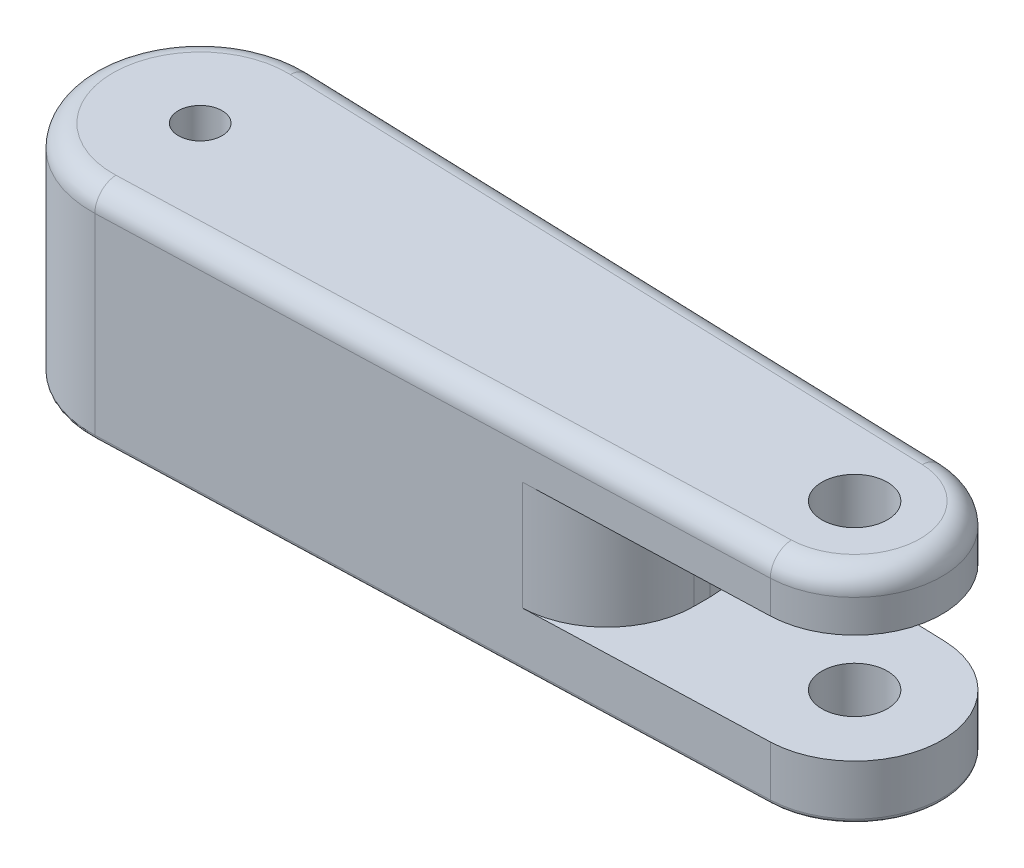
ISO-10303-21;
HEADER;
FILE_DESCRIPTION(('STEP AP214'),'2;1');
FILE_NAME('part.step','',(''),(''),'','','');
FILE_SCHEMA(('AUTOMOTIVE_DESIGN { 1 0 10303 214 1 1 1 1 }'));
ENDSEC;
DATA;
#1=APPLICATION_CONTEXT('core data for automotive mechanical design processes');
#2=APPLICATION_PROTOCOL_DEFINITION('international standard','automotive_design',2000,#1);
#3=PRODUCT_CONTEXT('',#1,'mechanical');
#4=PRODUCT('Part','Part','',(#3));
#5=PRODUCT_RELATED_PRODUCT_CATEGORY('part','',(#4));
#6=PRODUCT_DEFINITION_FORMATION('','',#4);
#7=PRODUCT_DEFINITION_CONTEXT('part definition',#1,'design');
#8=PRODUCT_DEFINITION('design','',#6,#7);
#9=PRODUCT_DEFINITION_SHAPE('','',#8);
#10=(LENGTH_UNIT() NAMED_UNIT(*) SI_UNIT(.MILLI.,.METRE.));
#11=(NAMED_UNIT(*) PLANE_ANGLE_UNIT() SI_UNIT($,.RADIAN.));
#12=(NAMED_UNIT(*) SI_UNIT($,.STERADIAN.) SOLID_ANGLE_UNIT());
#13=UNCERTAINTY_MEASURE_WITH_UNIT(LENGTH_MEASURE(1.E-05),#10,'distance_accuracy_value','');
#14=(GEOMETRIC_REPRESENTATION_CONTEXT(3) GLOBAL_UNCERTAINTY_ASSIGNED_CONTEXT((#13)) GLOBAL_UNIT_ASSIGNED_CONTEXT((#10,
#11,#12)) REPRESENTATION_CONTEXT('',''));
#15=CARTESIAN_POINT('',(0.,0.,0.));
#16=DIRECTION('',(0.,0.,1.));
#17=DIRECTION('',(1.,0.,0.));
#18=AXIS2_PLACEMENT_3D('',#15,#16,#17);
#19=CARTESIAN_POINT('',(-149.166666666667,-25.,-24.9861072509416));
#20=DIRECTION('',(0.0333333333333331,0.,-0.999444290037663));
#21=DIRECTION('',(-0.999444290037663,0.,-0.0333333333333331));
#22=AXIS2_PLACEMENT_3D('',#19,#20,#21);
#23=PLANE('',#22);
#24=DIRECTION('',(0.,1.,0.));
#25=VECTOR('',#24,1.);
#26=CARTESIAN_POINT('',(-149.166666666667,-25.,-24.9861072509416));
#27=LINE('',#26,#25);
#28=CARTESIAN_POINT('',(-149.166666666667,-24.,-24.9861072509416));
#29=VERTEX_POINT('',#28);
#30=CARTESIAN_POINT('',(-149.166666666667,20.,-24.9861072509416));
#31=VERTEX_POINT('',#30);
#32=EDGE_CURVE('E180',#29,#31,#27,.T.);
#33=ORIENTED_EDGE('',*,*,#32,.T.);
#34=DIRECTION('',(-0.999444290037663,0.,-0.0333333333333331));
#35=VECTOR('',#34,1.);
#36=CARTESIAN_POINT('',(-149.166666666667,20.,-24.9861072509416));
#37=LINE('',#36,#35);
#38=CARTESIAN_POINT('',(0.666666666666668,20.,-19.9888858007533));
#39=VERTEX_POINT('',#38);
#40=EDGE_CURVE('E11',#31,#39,#37,.F.);
#41=ORIENTED_EDGE('',*,*,#40,.T.);
#42=DIRECTION('',(0.,1.,0.));
#43=VECTOR('',#42,1.);
#44=CARTESIAN_POINT('',(0.666666666666668,-25.,-19.9888858007533));
#45=LINE('',#44,#43);
#46=CARTESIAN_POINT('',(0.666666666666668,12.5,-19.9888858007533));
#47=VERTEX_POINT('',#46);
#48=EDGE_CURVE('E166',#47,#39,#45,.T.);
#49=ORIENTED_EDGE('',*,*,#48,.F.);
#50=DIRECTION('',(-0.999444290037663,0.,-0.0333333333333331));
#51=VECTOR('',#50,1.);
#52=CARTESIAN_POINT('',(-149.166666666667,12.5,-24.9861072509416));
#53=LINE('',#52,#51);
#54=CARTESIAN_POINT('',(-54.3333333333333,12.5,-21.8232385021572));
#55=VERTEX_POINT('',#54);
#56=EDGE_CURVE('E197',#47,#55,#53,.T.);
#57=ORIENTED_EDGE('',*,*,#56,.T.);
#58=DIRECTION('',(0.,-1.,0.));
#59=VECTOR('',#58,1.);
#60=CARTESIAN_POINT('',(-54.3333333333334,-25.,-21.8232385021572));
#61=LINE('',#60,#59);
#62=CARTESIAN_POINT('',(-54.3333333333333,-12.5,-21.8232385021572));
#63=VERTEX_POINT('',#62);
#64=EDGE_CURVE('E208',#55,#63,#61,.T.);
#65=ORIENTED_EDGE('',*,*,#64,.T.);
#66=DIRECTION('',(0.999444290037663,0.,0.0333333333333331));
#67=VECTOR('',#66,1.);
#68=CARTESIAN_POINT('',(-149.166666666667,-12.5,-24.9861072509416));
#69=LINE('',#68,#67);
#70=CARTESIAN_POINT('',(0.666666666666668,-12.5,-19.9888858007533));
#71=VERTEX_POINT('',#70);
#72=EDGE_CURVE('E161',#63,#71,#69,.T.);
#73=ORIENTED_EDGE('',*,*,#72,.T.);
#74=CARTESIAN_POINT('',(0.666666666666668,-24.,-19.9888858007533));
#75=VERTEX_POINT('',#74);
#76=EDGE_CURVE('E160',#75,#71,#45,.T.);
#77=ORIENTED_EDGE('',*,*,#76,.F.);
#78=DIRECTION('',(-0.999444290037663,0.,-0.0333333333333331));
#79=VECTOR('',#78,1.);
#80=CARTESIAN_POINT('',(-149.166666666667,-24.,-24.9861072509416));
#81=LINE('',#80,#79);
#82=EDGE_CURVE('E189',#75,#29,#81,.T.);
#83=ORIENTED_EDGE('',*,*,#82,.T.);
#84=EDGE_LOOP('',(#33,#41,#49,#57,#65,#73,#77,#83));
#85=FACE_BOUND('',#84,.T.);
#86=ADVANCED_FACE('F36',(#85),#23,.T.);
#87=CARTESIAN_POINT('',(0.,-25.,0.));
#88=DIRECTION('',(0.,1.,0.));
#89=DIRECTION('',(0.,0.,1.));
#90=AXIS2_PLACEMENT_3D('',#87,#88,#89);
#91=CYLINDRICAL_SURFACE('',#90,20.);
#92=ORIENTED_EDGE('',*,*,#48,.T.);
#93=CARTESIAN_POINT('',(0.,20.,0.));
#94=DIRECTION('',(0.,1.,0.));
#95=DIRECTION('',(0.,0.,1.));
#96=AXIS2_PLACEMENT_3D('',#93,#94,#95);
#97=CIRCLE('',#96,20.);
#98=CARTESIAN_POINT('',(0.666666666666671,20.,19.9888858007533));
#99=VERTEX_POINT('',#98);
#100=EDGE_CURVE('E239',#39,#99,#97,.F.);
#101=ORIENTED_EDGE('',*,*,#100,.T.);
#102=DIRECTION('',(0.,1.,0.));
#103=VECTOR('',#102,1.);
#104=CARTESIAN_POINT('',(0.666666666666671,-25.,19.9888858007533));
#105=LINE('',#104,#103);
#106=CARTESIAN_POINT('',(0.666666666666671,12.5,19.9888858007533));
#107=VERTEX_POINT('',#106);
#108=EDGE_CURVE('E167',#107,#99,#105,.T.);
#109=ORIENTED_EDGE('',*,*,#108,.F.);
#110=CARTESIAN_POINT('',(0.,12.5,0.));
#111=DIRECTION('',(0.,-1.,0.));
#112=DIRECTION('',(0.,0.,-1.));
#113=AXIS2_PLACEMENT_3D('',#110,#111,#112);
#114=CIRCLE('',#113,20.);
#115=EDGE_CURVE('E273',#107,#47,#114,.F.);
#116=ORIENTED_EDGE('',*,*,#115,.T.);
#117=EDGE_LOOP('',(#92,#101,#109,#116));
#118=FACE_BOUND('',#117,.T.);
#119=ADVANCED_FACE('F295',(#118),#91,.T.);
#120=ORIENTED_EDGE('',*,*,#76,.T.);
#121=CARTESIAN_POINT('',(0.,-12.5,0.));
#122=DIRECTION('',(0.,1.,0.));
#123=DIRECTION('',(0.,0.,1.));
#124=AXIS2_PLACEMENT_3D('',#121,#122,#123);
#125=CIRCLE('',#124,20.);
#126=CARTESIAN_POINT('',(0.666666666666671,-12.5,19.9888858007533));
#127=VERTEX_POINT('',#126);
#128=EDGE_CURVE('E143',#71,#127,#125,.F.);
#129=ORIENTED_EDGE('',*,*,#128,.T.);
#130=CARTESIAN_POINT('',(0.666666666666671,-24.,19.9888858007533));
#131=VERTEX_POINT('',#130);
#132=EDGE_CURVE('E157',#131,#127,#105,.T.);
#133=ORIENTED_EDGE('',*,*,#132,.F.);
#134=CARTESIAN_POINT('',(0.,-24.,0.));
#135=DIRECTION('',(0.,1.,0.));
#136=DIRECTION('',(0.,0.,1.));
#137=AXIS2_PLACEMENT_3D('',#134,#135,#136);
#138=CIRCLE('',#137,20.);
#139=EDGE_CURVE('E191',#131,#75,#138,.T.);
#140=ORIENTED_EDGE('',*,*,#139,.T.);
#141=EDGE_LOOP('',(#120,#129,#133,#140));
#142=FACE_BOUND('',#141,.T.);
#143=ADVANCED_FACE('F156',(#142),#91,.T.);
#144=CARTESIAN_POINT('',(0.666666666666671,-25.,19.9888858007533));
#145=DIRECTION('',(0.0333333333333334,0.,0.999444290037663));
#146=DIRECTION('',(0.999444290037663,0.,-0.0333333333333334));
#147=AXIS2_PLACEMENT_3D('',#144,#145,#146);
#148=PLANE('',#147);
#149=ORIENTED_EDGE('',*,*,#108,.T.);
#150=DIRECTION('',(0.999444290037663,0.,-0.0333333333333334));
#151=VECTOR('',#150,1.);
#152=CARTESIAN_POINT('',(0.666666666666671,20.,19.9888858007533));
#153=LINE('',#152,#151);
#154=CARTESIAN_POINT('',(-149.166666666667,20.,24.9861072509416));
#155=VERTEX_POINT('',#154);
#156=EDGE_CURVE('E60',#99,#155,#153,.F.);
#157=ORIENTED_EDGE('',*,*,#156,.T.);
#158=DIRECTION('',(0.,1.,0.));
#159=VECTOR('',#158,1.);
#160=CARTESIAN_POINT('',(-149.166666666667,-25.,24.9861072509416));
#161=LINE('',#160,#159);
#162=CARTESIAN_POINT('',(-149.166666666667,-24.,24.9861072509416));
#163=VERTEX_POINT('',#162);
#164=EDGE_CURVE('E171',#163,#155,#161,.T.);
#165=ORIENTED_EDGE('',*,*,#164,.F.);
#166=DIRECTION('',(0.999444290037663,0.,-0.0333333333333334));
#167=VECTOR('',#166,1.);
#168=CARTESIAN_POINT('',(0.666666666666671,-24.,19.9888858007533));
#169=LINE('',#168,#167);
#170=EDGE_CURVE('E151',#163,#131,#169,.T.);
#171=ORIENTED_EDGE('',*,*,#170,.T.);
#172=ORIENTED_EDGE('',*,*,#132,.T.);
#173=DIRECTION('',(-0.999444290037663,0.,0.0333333333333334));
#174=VECTOR('',#173,1.);
#175=CARTESIAN_POINT('',(0.666666666666671,-12.5,19.9888858007533));
#176=LINE('',#175,#174);
#177=CARTESIAN_POINT('',(-54.3333333333333,-12.5,21.8232385021572));
#178=VERTEX_POINT('',#177);
#179=EDGE_CURVE('E139',#127,#178,#176,.T.);
#180=ORIENTED_EDGE('',*,*,#179,.T.);
#181=DIRECTION('',(0.,1.,0.));
#182=VECTOR('',#181,1.);
#183=CARTESIAN_POINT('',(-54.3333333333333,-25.,21.8232385021572));
#184=LINE('',#183,#182);
#185=CARTESIAN_POINT('',(-54.3333333333333,12.5,21.8232385021572));
#186=VERTEX_POINT('',#185);
#187=EDGE_CURVE('E215',#178,#186,#184,.T.);
#188=ORIENTED_EDGE('',*,*,#187,.T.);
#189=DIRECTION('',(0.999444290037663,0.,-0.0333333333333334));
#190=VECTOR('',#189,1.);
#191=CARTESIAN_POINT('',(0.666666666666671,12.5,19.9888858007533));
#192=LINE('',#191,#190);
#193=EDGE_CURVE('E150',#186,#107,#192,.T.);
#194=ORIENTED_EDGE('',*,*,#193,.T.);
#195=EDGE_LOOP('',(#149,#157,#165,#171,#172,#180,#188,#194));
#196=FACE_BOUND('',#195,.T.);
#197=ADVANCED_FACE('F164',(#196),#148,.T.);
#198=CARTESIAN_POINT('',(-150.,-25.,0.));
#199=DIRECTION('',(0.,1.,0.));
#200=DIRECTION('',(0.,0.,1.));
#201=AXIS2_PLACEMENT_3D('',#198,#199,#200);
#202=CYLINDRICAL_SURFACE('',#201,25.);
#203=ORIENTED_EDGE('',*,*,#164,.T.);
#204=CARTESIAN_POINT('',(-150.,20.,0.));
#205=DIRECTION('',(0.,1.,0.));
#206=DIRECTION('',(0.,0.,1.));
#207=AXIS2_PLACEMENT_3D('',#204,#205,#206);
#208=CIRCLE('',#207,25.);
#209=EDGE_CURVE('E45',#155,#31,#208,.F.);
#210=ORIENTED_EDGE('',*,*,#209,.T.);
#211=ORIENTED_EDGE('',*,*,#32,.F.);
#212=CARTESIAN_POINT('',(-150.,-24.,0.));
#213=DIRECTION('',(0.,1.,0.));
#214=DIRECTION('',(0.,0.,1.));
#215=AXIS2_PLACEMENT_3D('',#212,#213,#214);
#216=CIRCLE('',#215,25.);
#217=EDGE_CURVE('E176',#29,#163,#216,.T.);
#218=ORIENTED_EDGE('',*,*,#217,.T.);
#219=EDGE_LOOP('',(#203,#210,#211,#218));
#220=FACE_BOUND('',#219,.T.);
#221=ADVANCED_FACE('F324',(#220),#202,.T.);
#222=CARTESIAN_POINT('',(-150.,-25.,0.));
#223=DIRECTION('',(0.,1.,0.));
#224=DIRECTION('',(0.,0.,1.));
#225=AXIS2_PLACEMENT_3D('',#222,#223,#224);
#226=PLANE('',#225);
#227=CARTESIAN_POINT('',(0.,-25.,0.));
#228=DIRECTION('',(0.,1.,0.));
#229=DIRECTION('',(0.,0.,1.));
#230=AXIS2_PLACEMENT_3D('',#227,#228,#229);
#231=CIRCLE('',#230,7.5);
#232=CARTESIAN_POINT('',(0.,-25.,7.5));
#233=VERTEX_POINT('',#232);
#234=EDGE_CURVE('E264',#233,#233,#231,.T.);
#235=ORIENTED_EDGE('',*,*,#234,.T.);
#236=EDGE_LOOP('',(#235));
#237=FACE_BOUND('',#236,.T.);
#238=DIRECTION('',(0.999444290037663,0.,-0.0333333333333334));
#239=VECTOR('',#238,1.);
#240=CARTESIAN_POINT('',(-149.2,-25.,23.9866629609039));
#241=LINE('',#240,#239);
#242=CARTESIAN_POINT('',(0.633333333333338,-25.,18.9894415107156));
#243=VERTEX_POINT('',#242);
#244=CARTESIAN_POINT('',(-149.2,-25.,23.9866629609039));
#245=VERTEX_POINT('',#244);
#246=EDGE_CURVE('E179',#243,#245,#241,.F.);
#247=ORIENTED_EDGE('',*,*,#246,.T.);
#248=CARTESIAN_POINT('',(-150.,-25.,0.));
#249=DIRECTION('',(0.,1.,0.));
#250=DIRECTION('',(0.,0.,1.));
#251=AXIS2_PLACEMENT_3D('',#248,#249,#250);
#252=CIRCLE('',#251,24.);
#253=CARTESIAN_POINT('',(-149.2,-25.,-23.9866629609039));
#254=VERTEX_POINT('',#253);
#255=EDGE_CURVE('E186',#245,#254,#252,.F.);
#256=ORIENTED_EDGE('',*,*,#255,.T.);
#257=DIRECTION('',(-0.999444290037663,0.,-0.0333333333333331));
#258=VECTOR('',#257,1.);
#259=CARTESIAN_POINT('',(0.633333333333347,-25.,-18.9894415107156));
#260=LINE('',#259,#258);
#261=CARTESIAN_POINT('',(0.633333333333334,-25.,-18.9894415107156));
#262=VERTEX_POINT('',#261);
#263=EDGE_CURVE('E184',#254,#262,#260,.F.);
#264=ORIENTED_EDGE('',*,*,#263,.T.);
#265=CARTESIAN_POINT('',(0.,-25.,0.));
#266=DIRECTION('',(0.,1.,0.));
#267=DIRECTION('',(0.,0.,1.));
#268=AXIS2_PLACEMENT_3D('',#265,#266,#267);
#269=CIRCLE('',#268,19.);
#270=EDGE_CURVE('E182',#262,#243,#269,.F.);
#271=ORIENTED_EDGE('',*,*,#270,.T.);
#272=EDGE_LOOP('',(#247,#256,#264,#271));
#273=FACE_BOUND('',#272,.T.);
#274=CARTESIAN_POINT('',(-150.,-25.,0.));
#275=DIRECTION('',(0.,1.,0.));
#276=DIRECTION('',(0.,0.,1.));
#277=AXIS2_PLACEMENT_3D('',#274,#275,#276);
#278=CIRCLE('',#277,5.00000000000002);
#279=CARTESIAN_POINT('',(-150.,-25.,5.00000000000004));
#280=VERTEX_POINT('',#279);
#281=EDGE_CURVE('E175',#280,#280,#278,.T.);
#282=ORIENTED_EDGE('',*,*,#281,.T.);
#283=EDGE_LOOP('',(#282));
#284=FACE_BOUND('',#283,.T.);
#285=ADVANCED_FACE('F326',(#237,#273,#284),#226,.F.);
#286=CARTESIAN_POINT('',(-150.,-25.,0.));
#287=DIRECTION('',(0.,1.,0.));
#288=DIRECTION('',(0.,0.,1.));
#289=AXIS2_PLACEMENT_3D('',#286,#287,#288);
#290=CYLINDRICAL_SURFACE('',#289,5.00000000000002);
#291=ORIENTED_EDGE('',*,*,#281,.F.);
#292=EDGE_LOOP('',(#291));
#293=FACE_BOUND('',#292,.T.);
#294=CARTESIAN_POINT('',(-150.,25.,0.));
#295=DIRECTION('',(0.,1.,0.));
#296=DIRECTION('',(0.,0.,1.));
#297=AXIS2_PLACEMENT_3D('',#294,#295,#296);
#298=CIRCLE('',#297,5.00000000000002);
#299=CARTESIAN_POINT('',(-150.,25.,5.00000000000004));
#300=VERTEX_POINT('',#299);
#301=EDGE_CURVE('E204',#300,#300,#298,.T.);
#302=ORIENTED_EDGE('',*,*,#301,.T.);
#303=EDGE_LOOP('',(#302));
#304=FACE_BOUND('',#303,.T.);
#305=ADVANCED_FACE('F332',(#293,#304),#290,.F.);
#306=CARTESIAN_POINT('',(-150.,25.,0.));
#307=DIRECTION('',(0.,1.,0.));
#308=DIRECTION('',(0.,0.,1.));
#309=AXIS2_PLACEMENT_3D('',#306,#307,#308);
#310=PLANE('',#309);
#311=DIRECTION('',(0.999444290037663,0.,-0.0333333333333334));
#312=VECTOR('',#311,1.);
#313=CARTESIAN_POINT('',(-149.333333333333,25.,19.9888858007533));
#314=LINE('',#313,#312);
#315=CARTESIAN_POINT('',(-149.333333333333,25.,19.9888858007533));
#316=VERTEX_POINT('',#315);
#317=CARTESIAN_POINT('',(0.500000000000003,25.,14.991664350565));
#318=VERTEX_POINT('',#317);
#319=EDGE_CURVE('E234',#316,#318,#314,.T.);
#320=ORIENTED_EDGE('',*,*,#319,.T.);
#321=CARTESIAN_POINT('',(0.,25.,0.));
#322=DIRECTION('',(0.,1.,0.));
#323=DIRECTION('',(0.,0.,1.));
#324=AXIS2_PLACEMENT_3D('',#321,#322,#323);
#325=CIRCLE('',#324,15.);
#326=CARTESIAN_POINT('',(0.500000000000001,25.,-14.991664350565));
#327=VERTEX_POINT('',#326);
#328=EDGE_CURVE('E236',#318,#327,#325,.T.);
#329=ORIENTED_EDGE('',*,*,#328,.T.);
#330=DIRECTION('',(-0.999444290037663,0.,-0.0333333333333331));
#331=VECTOR('',#330,1.);
#332=CARTESIAN_POINT('',(-149.333333333333,25.,-19.9888858007532));
#333=LINE('',#332,#331);
#334=CARTESIAN_POINT('',(-149.333333333333,25.,-19.9888858007532));
#335=VERTEX_POINT('',#334);
#336=EDGE_CURVE('E225',#327,#335,#333,.T.);
#337=ORIENTED_EDGE('',*,*,#336,.T.);
#338=CARTESIAN_POINT('',(-150.,25.,0.));
#339=DIRECTION('',(0.,1.,0.));
#340=DIRECTION('',(0.,0.,1.));
#341=AXIS2_PLACEMENT_3D('',#338,#339,#340);
#342=CIRCLE('',#341,20.);
#343=EDGE_CURVE('E232',#335,#316,#342,.T.);
#344=ORIENTED_EDGE('',*,*,#343,.T.);
#345=EDGE_LOOP('',(#320,#329,#337,#344));
#346=FACE_BOUND('',#345,.T.);
#347=CARTESIAN_POINT('',(0.,25.,0.));
#348=DIRECTION('',(0.,1.,0.));
#349=DIRECTION('',(0.,0.,1.));
#350=AXIS2_PLACEMENT_3D('',#347,#348,#349);
#351=CIRCLE('',#350,7.5);
#352=CARTESIAN_POINT('',(0.,25.,7.5));
#353=VERTEX_POINT('',#352);
#354=EDGE_CURVE('E230',#353,#353,#351,.T.);
#355=ORIENTED_EDGE('',*,*,#354,.F.);
#356=EDGE_LOOP('',(#355));
#357=FACE_BOUND('',#356,.T.);
#358=ORIENTED_EDGE('',*,*,#301,.F.);
#359=EDGE_LOOP('',(#358));
#360=FACE_BOUND('',#359,.T.);
#361=ADVANCED_FACE('F346',(#346,#357,#360),#310,.T.);
#362=CARTESIAN_POINT('',(0.,-24.,0.));
#363=DIRECTION('',(0.,1.,0.));
#364=DIRECTION('',(0.,0.,1.));
#365=AXIS2_PLACEMENT_3D('',#362,#363,#364);
#366=TOROIDAL_SURFACE('',#365,19.,1.);
#367=CARTESIAN_POINT('',(0.633333333333337,-24.,18.9894415107156));
#368=DIRECTION('',(-0.999444290037663,0.,0.0333333333333336));
#369=DIRECTION('',(0.0333333333333336,0.,0.999444290037663));
#370=AXIS2_PLACEMENT_3D('',#367,#368,#369);
#371=CIRCLE('',#370,1.);
#372=EDGE_CURVE('E199',#243,#131,#371,.T.);
#373=ORIENTED_EDGE('',*,*,#372,.F.);
#374=ORIENTED_EDGE('',*,*,#270,.F.);
#375=CARTESIAN_POINT('',(0.633333333333334,-24.,-18.9894415107156));
#376=DIRECTION('',(-0.999444290037663,0.,-0.0333333333333334));
#377=DIRECTION('',(-0.0333333333333334,0.,0.999444290037663));
#378=AXIS2_PLACEMENT_3D('',#375,#376,#377);
#379=CIRCLE('',#378,1.);
#380=EDGE_CURVE('E202',#75,#262,#379,.T.);
#381=ORIENTED_EDGE('',*,*,#380,.F.);
#382=ORIENTED_EDGE('',*,*,#139,.F.);
#383=EDGE_LOOP('',(#373,#374,#381,#382));
#384=FACE_BOUND('',#383,.T.);
#385=ADVANCED_FACE('F315',(#384),#366,.T.);
#386=CARTESIAN_POINT('',(-149.2,-24.,-23.9866629609039));
#387=DIRECTION('',(0.999444290037663,0.,0.0333333333333331));
#388=DIRECTION('',(0.0333333333333331,0.,-0.999444290037663));
#389=AXIS2_PLACEMENT_3D('',#386,#387,#388);
#390=CYLINDRICAL_SURFACE('',#389,1.);
#391=ORIENTED_EDGE('',*,*,#380,.T.);
#392=ORIENTED_EDGE('',*,*,#263,.F.);
#393=CARTESIAN_POINT('',(-149.2,-24.,-23.9866629609039));
#394=DIRECTION('',(-0.999444290037663,0.,-0.0333333333333297));
#395=DIRECTION('',(-0.0333333333333297,0.,0.999444290037663));
#396=AXIS2_PLACEMENT_3D('',#393,#394,#395);
#397=CIRCLE('',#396,1.);
#398=EDGE_CURVE('E196',#29,#254,#397,.T.);
#399=ORIENTED_EDGE('',*,*,#398,.F.);
#400=ORIENTED_EDGE('',*,*,#82,.F.);
#401=EDGE_LOOP('',(#391,#392,#399,#400));
#402=FACE_BOUND('',#401,.T.);
#403=ADVANCED_FACE('F318',(#402),#390,.T.);
#404=CARTESIAN_POINT('',(0.633333333333338,-24.,18.9894415107156));
#405=DIRECTION('',(-0.999444290037663,0.,0.0333333333333334));
#406=DIRECTION('',(0.0333333333333334,0.,0.999444290037663));
#407=AXIS2_PLACEMENT_3D('',#404,#405,#406);
#408=CYLINDRICAL_SURFACE('',#407,1.);
#409=ORIENTED_EDGE('',*,*,#372,.T.);
#410=ORIENTED_EDGE('',*,*,#170,.F.);
#411=CARTESIAN_POINT('',(-149.2,-24.,23.9866629609039));
#412=DIRECTION('',(-0.999444290037663,0.,0.0333333333333297));
#413=DIRECTION('',(0.0333333333333297,0.,0.999444290037663));
#414=AXIS2_PLACEMENT_3D('',#411,#412,#413);
#415=CIRCLE('',#414,1.);
#416=EDGE_CURVE('E194',#245,#163,#415,.T.);
#417=ORIENTED_EDGE('',*,*,#416,.F.);
#418=ORIENTED_EDGE('',*,*,#246,.F.);
#419=EDGE_LOOP('',(#409,#410,#417,#418));
#420=FACE_BOUND('',#419,.T.);
#421=ADVANCED_FACE('F380',(#420),#408,.T.);
#422=CARTESIAN_POINT('',(-150.,-24.,0.));
#423=DIRECTION('',(0.,1.,0.));
#424=DIRECTION('',(0.,0.,1.));
#425=AXIS2_PLACEMENT_3D('',#422,#423,#424);
#426=TOROIDAL_SURFACE('',#425,24.,1.);
#427=ORIENTED_EDGE('',*,*,#398,.T.);
#428=ORIENTED_EDGE('',*,*,#255,.F.);
#429=ORIENTED_EDGE('',*,*,#416,.T.);
#430=ORIENTED_EDGE('',*,*,#217,.F.);
#431=EDGE_LOOP('',(#427,#428,#429,#430));
#432=FACE_BOUND('',#431,.T.);
#433=ADVANCED_FACE('F322',(#432),#426,.T.);
#434=CARTESIAN_POINT('',(-35.,12.5,49.));
#435=DIRECTION('',(0.,-1.,0.));
#436=DIRECTION('',(0.,0.,-1.));
#437=AXIS2_PLACEMENT_3D('',#434,#435,#436);
#438=PLANE('',#437);
#439=CARTESIAN_POINT('',(0.,12.5,0.));
#440=DIRECTION('',(0.,-1.,0.));
#441=DIRECTION('',(0.,0.,-1.));
#442=AXIS2_PLACEMENT_3D('',#439,#440,#441);
#443=CIRCLE('',#442,7.5);
#444=CARTESIAN_POINT('',(0.,12.5,-7.5));
#445=VERTEX_POINT('',#444);
#446=EDGE_CURVE('E229',#445,#445,#443,.T.);
#447=ORIENTED_EDGE('',*,*,#446,.F.);
#448=EDGE_LOOP('',(#447));
#449=FACE_BOUND('',#448,.T.);
#450=ORIENTED_EDGE('',*,*,#115,.F.);
#451=ORIENTED_EDGE('',*,*,#193,.F.);
#452=CARTESIAN_POINT('',(-55.,12.5,1.83435270140395));
#453=DIRECTION('',(0.,-1.,0.));
#454=DIRECTION('',(0.,0.,-1.));
#455=AXIS2_PLACEMENT_3D('',#452,#453,#454);
#456=CIRCLE('',#455,20.);
#457=CARTESIAN_POINT('',(-35.,12.5,1.83435270140395));
#458=VERTEX_POINT('',#457);
#459=EDGE_CURVE('E222',#186,#458,#456,.F.);
#460=ORIENTED_EDGE('',*,*,#459,.T.);
#461=DIRECTION('',(0.,0.,-1.));
#462=VECTOR('',#461,1.);
#463=CARTESIAN_POINT('',(-35.,12.5,49.));
#464=LINE('',#463,#462);
#465=CARTESIAN_POINT('',(-35.,12.5,-1.83435270140394));
#466=VERTEX_POINT('',#465);
#467=EDGE_CURVE('E162',#458,#466,#464,.T.);
#468=ORIENTED_EDGE('',*,*,#467,.T.);
#469=CARTESIAN_POINT('',(-55.,12.5,-1.83435270140394));
#470=DIRECTION('',(0.,-1.,0.));
#471=DIRECTION('',(0.,0.,-1.));
#472=AXIS2_PLACEMENT_3D('',#469,#470,#471);
#473=CIRCLE('',#472,20.);
#474=EDGE_CURVE('E219',#466,#55,#473,.F.);
#475=ORIENTED_EDGE('',*,*,#474,.T.);
#476=ORIENTED_EDGE('',*,*,#56,.F.);
#477=EDGE_LOOP('',(#450,#451,#460,#468,#475,#476));
#478=FACE_BOUND('',#477,.T.);
#479=ADVANCED_FACE('F298',(#449,#478),#438,.T.);
#480=CARTESIAN_POINT('',(-35.,-12.5,49.));
#481=DIRECTION('',(1.,0.,0.));
#482=DIRECTION('',(0.,0.,-1.));
#483=AXIS2_PLACEMENT_3D('',#480,#481,#482);
#484=PLANE('',#483);
#485=DIRECTION('',(0.,0.,-1.));
#486=VECTOR('',#485,1.);
#487=CARTESIAN_POINT('',(-35.,-12.5,49.));
#488=LINE('',#487,#486);
#489=CARTESIAN_POINT('',(-35.,-12.5,1.83435270140395));
#490=VERTEX_POINT('',#489);
#491=CARTESIAN_POINT('',(-35.,-12.5,-1.83435270140394));
#492=VERTEX_POINT('',#491);
#493=EDGE_CURVE('E267',#490,#492,#488,.T.);
#494=ORIENTED_EDGE('',*,*,#493,.T.);
#495=DIRECTION('',(0.,-1.,0.));
#496=VECTOR('',#495,1.);
#497=CARTESIAN_POINT('',(-35.,-12.5,-1.83435270140394));
#498=LINE('',#497,#496);
#499=EDGE_CURVE('E213',#492,#466,#498,.F.);
#500=ORIENTED_EDGE('',*,*,#499,.T.);
#501=ORIENTED_EDGE('',*,*,#467,.F.);
#502=DIRECTION('',(0.,1.,0.));
#503=VECTOR('',#502,1.);
#504=CARTESIAN_POINT('',(-35.,-12.5,1.83435270140395));
#505=LINE('',#504,#503);
#506=EDGE_CURVE('E211',#458,#490,#505,.F.);
#507=ORIENTED_EDGE('',*,*,#506,.T.);
#508=EDGE_LOOP('',(#494,#500,#501,#507));
#509=FACE_BOUND('',#508,.T.);
#510=ADVANCED_FACE('F304',(#509),#484,.T.);
#511=CARTESIAN_POINT('',(-35.,-12.5,49.));
#512=DIRECTION('',(0.,1.,0.));
#513=DIRECTION('',(0.,0.,1.));
#514=AXIS2_PLACEMENT_3D('',#511,#512,#513);
#515=PLANE('',#514);
#516=CARTESIAN_POINT('',(0.,-12.5,0.));
#517=DIRECTION('',(0.,1.,0.));
#518=DIRECTION('',(0.,0.,1.));
#519=AXIS2_PLACEMENT_3D('',#516,#517,#518);
#520=CIRCLE('',#519,7.5);
#521=CARTESIAN_POINT('',(0.,-12.5,7.5));
#522=VERTEX_POINT('',#521);
#523=EDGE_CURVE('E226',#522,#522,#520,.T.);
#524=ORIENTED_EDGE('',*,*,#523,.F.);
#525=EDGE_LOOP('',(#524));
#526=FACE_BOUND('',#525,.T.);
#527=ORIENTED_EDGE('',*,*,#493,.F.);
#528=CARTESIAN_POINT('',(-55.,-12.5,1.83435270140395));
#529=DIRECTION('',(0.,1.,0.));
#530=DIRECTION('',(0.,0.,1.));
#531=AXIS2_PLACEMENT_3D('',#528,#529,#530);
#532=CIRCLE('',#531,20.);
#533=EDGE_CURVE('E146',#490,#178,#532,.F.);
#534=ORIENTED_EDGE('',*,*,#533,.T.);
#535=ORIENTED_EDGE('',*,*,#179,.F.);
#536=ORIENTED_EDGE('',*,*,#128,.F.);
#537=ORIENTED_EDGE('',*,*,#72,.F.);
#538=CARTESIAN_POINT('',(-55.,-12.5,-1.83435270140394));
#539=DIRECTION('',(0.,1.,0.));
#540=DIRECTION('',(0.,0.,1.));
#541=AXIS2_PLACEMENT_3D('',#538,#539,#540);
#542=CIRCLE('',#541,20.);
#543=EDGE_CURVE('E217',#63,#492,#542,.F.);
#544=ORIENTED_EDGE('',*,*,#543,.T.);
#545=EDGE_LOOP('',(#527,#534,#535,#536,#537,#544));
#546=FACE_BOUND('',#545,.T.);
#547=ADVANCED_FACE('F142',(#526,#546),#515,.T.);
#548=CARTESIAN_POINT('',(-55.,-25.,-1.83435270140394));
#549=DIRECTION('',(0.,-1.,0.));
#550=DIRECTION('',(0.,0.,-1.));
#551=AXIS2_PLACEMENT_3D('',#548,#549,#550);
#552=CYLINDRICAL_SURFACE('',#551,20.);
#553=ORIENTED_EDGE('',*,*,#474,.F.);
#554=ORIENTED_EDGE('',*,*,#499,.F.);
#555=ORIENTED_EDGE('',*,*,#543,.F.);
#556=ORIENTED_EDGE('',*,*,#64,.F.);
#557=EDGE_LOOP('',(#553,#554,#555,#556));
#558=FACE_BOUND('',#557,.T.);
#559=ADVANCED_FACE('F310',(#558),#552,.T.);
#560=CARTESIAN_POINT('',(-55.,-25.,1.83435270140395));
#561=DIRECTION('',(0.,1.,0.));
#562=DIRECTION('',(0.,0.,1.));
#563=AXIS2_PLACEMENT_3D('',#560,#561,#562);
#564=CYLINDRICAL_SURFACE('',#563,20.);
#565=ORIENTED_EDGE('',*,*,#533,.F.);
#566=ORIENTED_EDGE('',*,*,#506,.F.);
#567=ORIENTED_EDGE('',*,*,#459,.F.);
#568=ORIENTED_EDGE('',*,*,#187,.F.);
#569=EDGE_LOOP('',(#565,#566,#567,#568));
#570=FACE_BOUND('',#569,.T.);
#571=ADVANCED_FACE('F302',(#570),#564,.T.);
#572=CARTESIAN_POINT('',(0.,-40.,0.));
#573=DIRECTION('',(0.,1.,0.));
#574=DIRECTION('',(0.,0.,1.));
#575=AXIS2_PLACEMENT_3D('',#572,#573,#574);
#576=CYLINDRICAL_SURFACE('',#575,7.5);
#577=ORIENTED_EDGE('',*,*,#523,.T.);
#578=EDGE_LOOP('',(#577));
#579=FACE_BOUND('',#578,.T.);
#580=ORIENTED_EDGE('',*,*,#234,.F.);
#581=EDGE_LOOP('',(#580));
#582=FACE_BOUND('',#581,.T.);
#583=ADVANCED_FACE('F359',(#579,#582),#576,.F.);
#584=ORIENTED_EDGE('',*,*,#446,.T.);
#585=EDGE_LOOP('',(#584));
#586=FACE_BOUND('',#585,.T.);
#587=ORIENTED_EDGE('',*,*,#354,.T.);
#588=EDGE_LOOP('',(#587));
#589=FACE_BOUND('',#588,.T.);
#590=ADVANCED_FACE('F361',(#586,#589),#576,.F.);
#591=CARTESIAN_POINT('',(-150.,20.,0.));
#592=DIRECTION('',(0.,1.,0.));
#593=DIRECTION('',(0.,0.,1.));
#594=AXIS2_PLACEMENT_3D('',#591,#592,#593);
#595=TOROIDAL_SURFACE('',#594,20.,5.);
#596=CARTESIAN_POINT('',(-149.333333333333,20.,-19.9888858007532));
#597=DIRECTION('',(0.999444290037663,0.,0.0333333333333352));
#598=DIRECTION('',(0.0333333333333352,0.,-0.999444290037663));
#599=AXIS2_PLACEMENT_3D('',#596,#597,#598);
#600=CIRCLE('',#599,5.);
#601=EDGE_CURVE('E247',#31,#335,#600,.T.);
#602=ORIENTED_EDGE('',*,*,#601,.F.);
#603=ORIENTED_EDGE('',*,*,#209,.F.);
#604=CARTESIAN_POINT('',(-149.333333333333,20.,19.9888858007533));
#605=DIRECTION('',(0.999444290037663,0.,-0.0333333333333352));
#606=DIRECTION('',(-0.0333333333333352,0.,-0.999444290037663));
#607=AXIS2_PLACEMENT_3D('',#604,#605,#606);
#608=CIRCLE('',#607,5.);
#609=EDGE_CURVE('E40',#316,#155,#608,.T.);
#610=ORIENTED_EDGE('',*,*,#609,.F.);
#611=ORIENTED_EDGE('',*,*,#343,.F.);
#612=EDGE_LOOP('',(#602,#603,#610,#611));
#613=FACE_BOUND('',#612,.T.);
#614=ADVANCED_FACE('F38',(#613),#595,.T.);
#615=CARTESIAN_POINT('',(-149.333333333333,20.,19.9888858007533));
#616=DIRECTION('',(0.999444290037663,0.,-0.0333333333333334));
#617=DIRECTION('',(-0.0333333333333334,0.,-0.999444290037663));
#618=AXIS2_PLACEMENT_3D('',#615,#616,#617);
#619=CYLINDRICAL_SURFACE('',#618,5.);
#620=ORIENTED_EDGE('',*,*,#609,.T.);
#621=ORIENTED_EDGE('',*,*,#156,.F.);
#622=CARTESIAN_POINT('',(0.500000000000003,20.,14.991664350565));
#623=DIRECTION('',(0.999444290037663,0.,-0.0333333333333335));
#624=DIRECTION('',(-0.0333333333333335,0.,-0.999444290037663));
#625=AXIS2_PLACEMENT_3D('',#622,#623,#624);
#626=CIRCLE('',#625,5.);
#627=EDGE_CURVE('E246',#318,#99,#626,.T.);
#628=ORIENTED_EDGE('',*,*,#627,.F.);
#629=ORIENTED_EDGE('',*,*,#319,.F.);
#630=EDGE_LOOP('',(#620,#621,#628,#629));
#631=FACE_BOUND('',#630,.T.);
#632=ADVANCED_FACE('F396',(#631),#619,.T.);
#633=CARTESIAN_POINT('',(-149.333333333333,20.,-19.9888858007532));
#634=DIRECTION('',(-0.999444290037663,0.,-0.0333333333333331));
#635=DIRECTION('',(-0.0333333333333331,0.,0.999444290037663));
#636=AXIS2_PLACEMENT_3D('',#633,#634,#635);
#637=CYLINDRICAL_SURFACE('',#636,5.);
#638=ORIENTED_EDGE('',*,*,#601,.T.);
#639=ORIENTED_EDGE('',*,*,#336,.F.);
#640=CARTESIAN_POINT('',(0.500000000000002,20.,-14.991664350565));
#641=DIRECTION('',(0.999444290037663,0.,0.0333333333333331));
#642=DIRECTION('',(0.0333333333333332,0.,-0.999444290037663));
#643=AXIS2_PLACEMENT_3D('',#640,#641,#642);
#644=CIRCLE('',#643,5.);
#645=EDGE_CURVE('E244',#39,#327,#644,.T.);
#646=ORIENTED_EDGE('',*,*,#645,.F.);
#647=ORIENTED_EDGE('',*,*,#40,.F.);
#648=EDGE_LOOP('',(#638,#639,#646,#647));
#649=FACE_BOUND('',#648,.T.);
#650=ADVANCED_FACE('F287',(#649),#637,.T.);
#651=CARTESIAN_POINT('',(0.,20.,0.));
#652=DIRECTION('',(0.,1.,0.));
#653=DIRECTION('',(0.,0.,1.));
#654=AXIS2_PLACEMENT_3D('',#651,#652,#653);
#655=TOROIDAL_SURFACE('',#654,15.,5.);
#656=ORIENTED_EDGE('',*,*,#627,.T.);
#657=ORIENTED_EDGE('',*,*,#100,.F.);
#658=ORIENTED_EDGE('',*,*,#645,.T.);
#659=ORIENTED_EDGE('',*,*,#328,.F.);
#660=EDGE_LOOP('',(#656,#657,#658,#659));
#661=FACE_BOUND('',#660,.T.);
#662=ADVANCED_FACE('F291',(#661),#655,.T.);
#663=CLOSED_SHELL('',(#86,#119,#143,#197,#221,#285,#305,#361,#385,#403,#421,#433,#479,#510,#547,
#559,#571,#583,#590,#614,#632,#650,#662));
#664=MANIFOLD_SOLID_BREP('B2',#663);
#665=ADVANCED_BREP_SHAPE_REPRESENTATION('',(#18,#664),#14);
#666=SHAPE_DEFINITION_REPRESENTATION(#9,#665);
ENDSEC;
END-ISO-10303-21;
